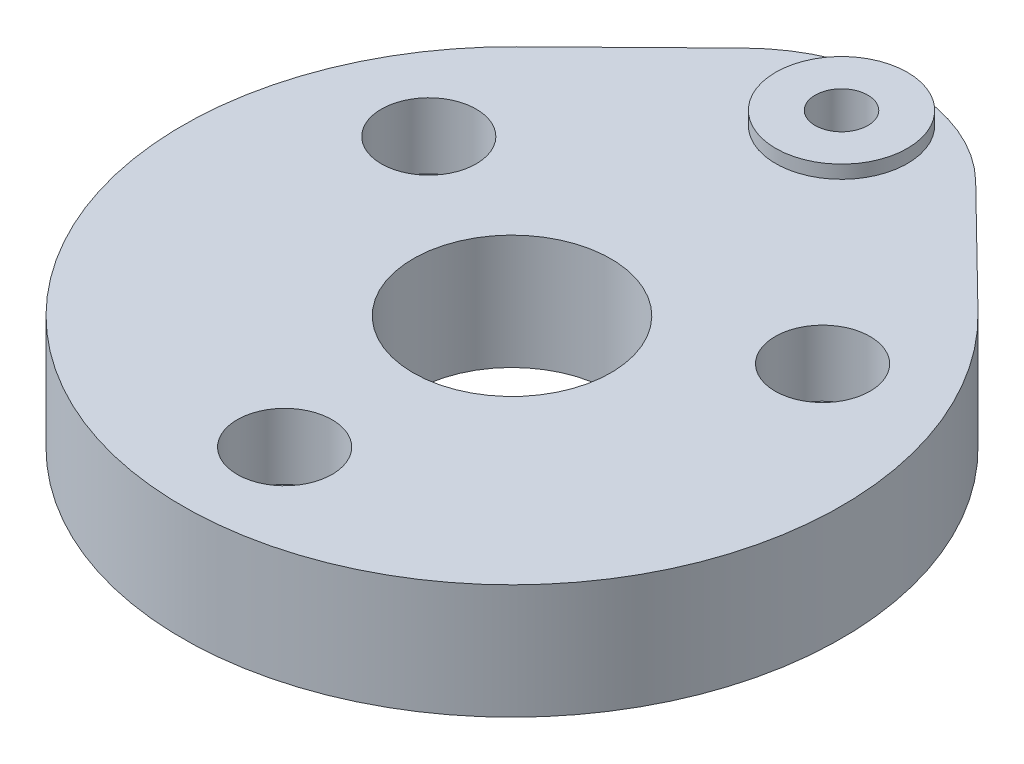
ISO-10303-21;
HEADER;
FILE_DESCRIPTION(('STEP AP214'),'2;1');
FILE_NAME('part.step','',(''),(''),'','','');
FILE_SCHEMA(('AUTOMOTIVE_DESIGN { 1 0 10303 214 1 1 1 1 }'));
ENDSEC;
DATA;
#1=APPLICATION_CONTEXT('core data for automotive mechanical design processes');
#2=APPLICATION_PROTOCOL_DEFINITION('international standard','automotive_design',2000,#1);
#3=PRODUCT_CONTEXT('',#1,'mechanical');
#4=PRODUCT('Part','Part','',(#3));
#5=PRODUCT_RELATED_PRODUCT_CATEGORY('part','',(#4));
#6=PRODUCT_DEFINITION_FORMATION('','',#4);
#7=PRODUCT_DEFINITION_CONTEXT('part definition',#1,'design');
#8=PRODUCT_DEFINITION('design','',#6,#7);
#9=PRODUCT_DEFINITION_SHAPE('','',#8);
#10=(LENGTH_UNIT() NAMED_UNIT(*) SI_UNIT(.MILLI.,.METRE.));
#11=(NAMED_UNIT(*) PLANE_ANGLE_UNIT() SI_UNIT($,.RADIAN.));
#12=(NAMED_UNIT(*) SI_UNIT($,.STERADIAN.) SOLID_ANGLE_UNIT());
#13=UNCERTAINTY_MEASURE_WITH_UNIT(LENGTH_MEASURE(1.E-05),#10,'distance_accuracy_value','');
#14=(GEOMETRIC_REPRESENTATION_CONTEXT(3) GLOBAL_UNCERTAINTY_ASSIGNED_CONTEXT((#13)) GLOBAL_UNIT_ASSIGNED_CONTEXT((#10,
#11,#12)) REPRESENTATION_CONTEXT('',''));
#15=CARTESIAN_POINT('',(0.,0.,0.));
#16=DIRECTION('',(0.,0.,1.));
#17=DIRECTION('',(1.,0.,0.));
#18=AXIS2_PLACEMENT_3D('',#15,#16,#17);
#19=CARTESIAN_POINT('',(0.,0.,-25.));
#20=DIRECTION('',(0.,1.,0.));
#21=DIRECTION('',(0.,0.,1.));
#22=AXIS2_PLACEMENT_3D('',#19,#20,#21);
#23=CYLINDRICAL_SURFACE('',#22,2.);
#24=CARTESIAN_POINT('',(0.,9.7,-25.));
#25=DIRECTION('',(0.,1.,0.));
#26=DIRECTION('',(0.,0.,1.));
#27=AXIS2_PLACEMENT_3D('',#24,#25,#26);
#28=CIRCLE('',#27,2.);
#29=CARTESIAN_POINT('',(0.,9.7,-23.));
#30=VERTEX_POINT('',#29);
#31=EDGE_CURVE('E340',#30,#30,#28,.T.);
#32=ORIENTED_EDGE('',*,*,#31,.T.);
#33=EDGE_LOOP('',(#32));
#34=FACE_BOUND('',#33,.T.);
#35=CARTESIAN_POINT('',(0.,2.7,-25.));
#36=DIRECTION('',(0.,-1.,0.));
#37=DIRECTION('',(0.,0.,-1.));
#38=AXIS2_PLACEMENT_3D('',#35,#36,#37);
#39=CIRCLE('',#38,2.);
#40=CARTESIAN_POINT('',(0.,2.7,-27.));
#41=VERTEX_POINT('',#40);
#42=EDGE_CURVE('E45',#41,#41,#39,.F.);
#43=ORIENTED_EDGE('',*,*,#42,.F.);
#44=EDGE_LOOP('',(#43));
#45=FACE_BOUND('',#44,.T.);
#46=ADVANCED_FACE('F41',(#34,#45),#23,.F.);
#47=CARTESIAN_POINT('',(14.9389382152816,8.7,-8.62500000000002));
#48=DIRECTION('',(0.,-1.,0.));
#49=DIRECTION('',(0.,0.,-1.));
#50=AXIS2_PLACEMENT_3D('',#47,#48,#49);
#51=CYLINDRICAL_SURFACE('',#50,1.9);
#52=CARTESIAN_POINT('',(14.9389382152816,0.,-8.62500000000002));
#53=DIRECTION('',(0.,1.,0.));
#54=DIRECTION('',(0.,0.,1.));
#55=AXIS2_PLACEMENT_3D('',#52,#53,#54);
#56=CIRCLE('',#55,1.9);
#57=CARTESIAN_POINT('',(14.9389382152816,0.,-6.72500000000003));
#58=VERTEX_POINT('',#57);
#59=EDGE_CURVE('E174',#58,#58,#56,.T.);
#60=ORIENTED_EDGE('',*,*,#59,.F.);
#61=EDGE_LOOP('',(#60));
#62=FACE_BOUND('',#61,.T.);
#63=CARTESIAN_POINT('',(14.9389382152816,3.7,-8.62500000000002));
#64=DIRECTION('',(0.,1.,0.));
#65=DIRECTION('',(0.,0.,1.));
#66=AXIS2_PLACEMENT_3D('',#63,#64,#65);
#67=CIRCLE('',#66,1.9);
#68=CARTESIAN_POINT('',(14.9389382152816,3.7,-6.72500000000003));
#69=VERTEX_POINT('',#68);
#70=EDGE_CURVE('E165',#69,#69,#67,.T.);
#71=ORIENTED_EDGE('',*,*,#70,.T.);
#72=EDGE_LOOP('',(#71));
#73=FACE_BOUND('',#72,.T.);
#74=ADVANCED_FACE('F193',(#62,#73),#51,.F.);
#75=CARTESIAN_POINT('',(0.,8.7,17.25));
#76=DIRECTION('',(0.,-1.,0.));
#77=DIRECTION('',(0.,0.,-1.));
#78=AXIS2_PLACEMENT_3D('',#75,#76,#77);
#79=CYLINDRICAL_SURFACE('',#78,1.9);
#80=CARTESIAN_POINT('',(0.,0.,17.25));
#81=DIRECTION('',(0.,1.,0.));
#82=DIRECTION('',(0.,0.,1.));
#83=AXIS2_PLACEMENT_3D('',#80,#81,#82);
#84=CIRCLE('',#83,1.9);
#85=CARTESIAN_POINT('',(0.,0.,19.15));
#86=VERTEX_POINT('',#85);
#87=EDGE_CURVE('E164',#86,#86,#84,.T.);
#88=ORIENTED_EDGE('',*,*,#87,.F.);
#89=EDGE_LOOP('',(#88));
#90=FACE_BOUND('',#89,.T.);
#91=CARTESIAN_POINT('',(0.,3.7,17.25));
#92=DIRECTION('',(0.,1.,0.));
#93=DIRECTION('',(0.,0.,1.));
#94=AXIS2_PLACEMENT_3D('',#91,#92,#93);
#95=CIRCLE('',#94,1.9);
#96=CARTESIAN_POINT('',(0.,3.7,19.15));
#97=VERTEX_POINT('',#96);
#98=EDGE_CURVE('E186',#97,#97,#95,.T.);
#99=ORIENTED_EDGE('',*,*,#98,.T.);
#100=EDGE_LOOP('',(#99));
#101=FACE_BOUND('',#100,.T.);
#102=ADVANCED_FACE('F219',(#90,#101),#79,.F.);
#103=CARTESIAN_POINT('',(-14.9389382152816,8.7,-8.62499999999998));
#104=DIRECTION('',(0.,-1.,0.));
#105=DIRECTION('',(0.,0.,-1.));
#106=AXIS2_PLACEMENT_3D('',#103,#104,#105);
#107=CYLINDRICAL_SURFACE('',#106,1.89999999999999);
#108=CARTESIAN_POINT('',(-14.9389382152816,0.,-8.62499999999998));
#109=DIRECTION('',(0.,1.,0.));
#110=DIRECTION('',(0.,0.,1.));
#111=AXIS2_PLACEMENT_3D('',#108,#109,#110);
#112=CIRCLE('',#111,1.89999999999999);
#113=CARTESIAN_POINT('',(-14.9389382152816,0.,-6.72499999999998));
#114=VERTEX_POINT('',#113);
#115=EDGE_CURVE('E160',#114,#114,#112,.T.);
#116=ORIENTED_EDGE('',*,*,#115,.F.);
#117=EDGE_LOOP('',(#116));
#118=FACE_BOUND('',#117,.T.);
#119=CARTESIAN_POINT('',(-14.9389382152816,3.7,-8.62499999999998));
#120=DIRECTION('',(0.,1.,0.));
#121=DIRECTION('',(0.,0.,1.));
#122=AXIS2_PLACEMENT_3D('',#119,#120,#121);
#123=CIRCLE('',#122,1.89999999999999);
#124=CARTESIAN_POINT('',(-14.9389382152816,3.7,-6.72499999999998));
#125=VERTEX_POINT('',#124);
#126=EDGE_CURVE('E139',#125,#125,#123,.T.);
#127=ORIENTED_EDGE('',*,*,#126,.T.);
#128=EDGE_LOOP('',(#127));
#129=FACE_BOUND('',#128,.T.);
#130=ADVANCED_FACE('F211',(#118,#129),#107,.F.);
#131=CARTESIAN_POINT('',(0.,8.7,0.));
#132=DIRECTION('',(0.,1.,0.));
#133=DIRECTION('',(0.,0.,1.));
#134=AXIS2_PLACEMENT_3D('',#131,#132,#133);
#135=PLANE('',#134);
#136=CARTESIAN_POINT('',(0.,8.7,17.25));
#137=DIRECTION('',(0.,1.,0.));
#138=DIRECTION('',(0.,0.,1.));
#139=AXIS2_PLACEMENT_3D('',#136,#137,#138);
#140=CIRCLE('',#139,3.6);
#141=CARTESIAN_POINT('',(0.,8.7,20.85));
#142=VERTEX_POINT('',#141);
#143=EDGE_CURVE('E140',#142,#142,#140,.T.);
#144=ORIENTED_EDGE('',*,*,#143,.F.);
#145=EDGE_LOOP('',(#144));
#146=FACE_BOUND('',#145,.T.);
#147=CARTESIAN_POINT('',(-14.9389382152816,8.7,-8.62499999999997));
#148=DIRECTION('',(0.,1.,0.));
#149=DIRECTION('',(0.,0.,1.));
#150=AXIS2_PLACEMENT_3D('',#147,#148,#149);
#151=CIRCLE('',#150,3.6);
#152=CARTESIAN_POINT('',(-14.9389382152816,8.7,-5.02499999999997));
#153=VERTEX_POINT('',#152);
#154=EDGE_CURVE('E148',#153,#153,#151,.T.);
#155=ORIENTED_EDGE('',*,*,#154,.F.);
#156=EDGE_LOOP('',(#155));
#157=FACE_BOUND('',#156,.T.);
#158=CARTESIAN_POINT('',(14.9389382152816,8.7,-8.62500000000002));
#159=DIRECTION('',(0.,1.,0.));
#160=DIRECTION('',(0.,0.,1.));
#161=AXIS2_PLACEMENT_3D('',#158,#159,#160);
#162=CIRCLE('',#161,3.6);
#163=CARTESIAN_POINT('',(14.9389382152816,8.7,-5.02500000000002));
#164=VERTEX_POINT('',#163);
#165=EDGE_CURVE('E156',#164,#164,#162,.T.);
#166=ORIENTED_EDGE('',*,*,#165,.F.);
#167=EDGE_LOOP('',(#166));
#168=FACE_BOUND('',#167,.T.);
#169=CARTESIAN_POINT('',(0.,8.7,-17.5));
#170=DIRECTION('',(0.,1.,0.));
#171=DIRECTION('',(0.,0.,1.));
#172=AXIS2_PLACEMENT_3D('',#169,#170,#171);
#173=CIRCLE('',#172,12.5);
#174=CARTESIAN_POINT('',(0.,8.7,-30.));
#175=VERTEX_POINT('',#174);
#176=CARTESIAN_POINT('',(8.74817765279707,8.7,-26.4285714285714));
#177=VERTEX_POINT('',#176);
#178=EDGE_CURVE('E87',#175,#177,#173,.F.);
#179=ORIENTED_EDGE('',*,*,#178,.F.);
#180=CARTESIAN_POINT('',(0.,8.7,-25.));
#181=DIRECTION('',(0.,1.,0.));
#182=DIRECTION('',(0.,0.,1.));
#183=AXIS2_PLACEMENT_3D('',#180,#181,#182);
#184=CIRCLE('',#183,5.);
#185=EDGE_CURVE('E103',#175,#175,#184,.T.);
#186=ORIENTED_EDGE('',*,*,#185,.F.);
#187=CARTESIAN_POINT('',(-8.74817765279707,8.7,-26.4285714285714));
#188=VERTEX_POINT('',#187);
#189=EDGE_CURVE('E83',#188,#175,#173,.F.);
#190=ORIENTED_EDGE('',*,*,#189,.F.);
#191=DIRECTION('',(0.714285714285714,0.,-0.699854212223765));
#192=VECTOR('',#191,1.);
#193=CARTESIAN_POINT('',(-17.4963553055941,8.7,-17.8571428571429));
#194=LINE('',#193,#192);
#195=CARTESIAN_POINT('',(-17.4963553055941,8.7,-17.8571428571429));
#196=VERTEX_POINT('',#195);
#197=EDGE_CURVE('E97',#196,#188,#194,.T.);
#198=ORIENTED_EDGE('',*,*,#197,.F.);
#199=CARTESIAN_POINT('',(0.,8.7,0.));
#200=DIRECTION('',(0.,1.,0.));
#201=DIRECTION('',(0.,0.,1.));
#202=AXIS2_PLACEMENT_3D('',#199,#200,#201);
#203=CIRCLE('',#202,25.);
#204=CARTESIAN_POINT('',(17.4963553055941,8.7,-17.8571428571429));
#205=VERTEX_POINT('',#204);
#206=EDGE_CURVE('E11',#196,#205,#203,.T.);
#207=ORIENTED_EDGE('',*,*,#206,.T.);
#208=DIRECTION('',(0.714285714285714,0.,0.699854212223765));
#209=VECTOR('',#208,1.);
#210=CARTESIAN_POINT('',(17.4963553055941,8.7,-17.8571428571429));
#211=LINE('',#210,#209);
#212=EDGE_CURVE('E105',#177,#205,#211,.T.);
#213=ORIENTED_EDGE('',*,*,#212,.F.);
#214=EDGE_LOOP('',(#179,#186,#190,#198,#207,#213));
#215=FACE_BOUND('',#214,.T.);
#216=CARTESIAN_POINT('',(0.,8.7,0.));
#217=DIRECTION('',(0.,1.,0.));
#218=DIRECTION('',(0.,0.,1.));
#219=AXIS2_PLACEMENT_3D('',#216,#217,#218);
#220=CIRCLE('',#219,7.5);
#221=CARTESIAN_POINT('',(0.,8.7,7.5));
#222=VERTEX_POINT('',#221);
#223=EDGE_CURVE('E170',#222,#222,#220,.T.);
#224=ORIENTED_EDGE('',*,*,#223,.F.);
#225=EDGE_LOOP('',(#224));
#226=FACE_BOUND('',#225,.T.);
#227=ADVANCED_FACE('F100',(#146,#157,#168,#215,#226),#135,.T.);
#228=CARTESIAN_POINT('',(0.,0.,0.));
#229=DIRECTION('',(0.,1.,0.));
#230=DIRECTION('',(0.,0.,1.));
#231=AXIS2_PLACEMENT_3D('',#228,#229,#230);
#232=PLANE('',#231);
#233=CARTESIAN_POINT('',(0.,0.,-25.));
#234=DIRECTION('',(0.,-1.,0.));
#235=DIRECTION('',(0.,0.,-1.));
#236=AXIS2_PLACEMENT_3D('',#233,#234,#235);
#237=CIRCLE('',#236,3.75);
#238=CARTESIAN_POINT('',(0.,0.,-28.75));
#239=VERTEX_POINT('',#238);
#240=EDGE_CURVE('E349',#239,#239,#237,.T.);
#241=ORIENTED_EDGE('',*,*,#240,.F.);
#242=EDGE_LOOP('',(#241));
#243=FACE_BOUND('',#242,.T.);
#244=CARTESIAN_POINT('',(0.,0.,0.));
#245=DIRECTION('',(0.,1.,0.));
#246=DIRECTION('',(0.,0.,1.));
#247=AXIS2_PLACEMENT_3D('',#244,#245,#246);
#248=CIRCLE('',#247,25.);
#249=CARTESIAN_POINT('',(-17.4963553055941,0.,-17.8571428571429));
#250=VERTEX_POINT('',#249);
#251=CARTESIAN_POINT('',(17.4963553055941,0.,-17.8571428571429));
#252=VERTEX_POINT('',#251);
#253=EDGE_CURVE('E51',#250,#252,#248,.T.);
#254=ORIENTED_EDGE('',*,*,#253,.F.);
#255=DIRECTION('',(-0.714285714285714,0.,0.699854212223765));
#256=VECTOR('',#255,1.);
#257=CARTESIAN_POINT('',(-17.4963553055941,0.,-17.8571428571429));
#258=LINE('',#257,#256);
#259=CARTESIAN_POINT('',(-8.74817765279707,0.,-26.4285714285714));
#260=VERTEX_POINT('',#259);
#261=EDGE_CURVE('E122',#260,#250,#258,.T.);
#262=ORIENTED_EDGE('',*,*,#261,.F.);
#263=CARTESIAN_POINT('',(0.,0.,-17.5));
#264=DIRECTION('',(0.,1.,0.));
#265=DIRECTION('',(0.,0.,1.));
#266=AXIS2_PLACEMENT_3D('',#263,#264,#265);
#267=CIRCLE('',#266,12.5);
#268=CARTESIAN_POINT('',(8.74817765279707,0.,-26.4285714285714));
#269=VERTEX_POINT('',#268);
#270=EDGE_CURVE('E113',#269,#260,#267,.T.);
#271=ORIENTED_EDGE('',*,*,#270,.F.);
#272=DIRECTION('',(-0.714285714285714,0.,-0.699854212223765));
#273=VECTOR('',#272,1.);
#274=CARTESIAN_POINT('',(17.4963553055941,0.,-17.8571428571429));
#275=LINE('',#274,#273);
#276=EDGE_CURVE('E134',#252,#269,#275,.T.);
#277=ORIENTED_EDGE('',*,*,#276,.F.);
#278=EDGE_LOOP('',(#254,#262,#271,#277));
#279=FACE_BOUND('',#278,.T.);
#280=ORIENTED_EDGE('',*,*,#59,.T.);
#281=EDGE_LOOP('',(#280));
#282=FACE_BOUND('',#281,.T.);
#283=CARTESIAN_POINT('',(0.,0.,0.));
#284=DIRECTION('',(0.,1.,0.));
#285=DIRECTION('',(0.,0.,1.));
#286=AXIS2_PLACEMENT_3D('',#283,#284,#285);
#287=CIRCLE('',#286,7.5);
#288=CARTESIAN_POINT('',(0.,0.,7.5));
#289=VERTEX_POINT('',#288);
#290=EDGE_CURVE('E169',#289,#289,#287,.T.);
#291=ORIENTED_EDGE('',*,*,#290,.T.);
#292=EDGE_LOOP('',(#291));
#293=FACE_BOUND('',#292,.T.);
#294=ORIENTED_EDGE('',*,*,#87,.T.);
#295=EDGE_LOOP('',(#294));
#296=FACE_BOUND('',#295,.T.);
#297=ORIENTED_EDGE('',*,*,#115,.T.);
#298=EDGE_LOOP('',(#297));
#299=FACE_BOUND('',#298,.T.);
#300=ADVANCED_FACE('F210',(#243,#279,#282,#293,#296,#299),#232,.F.);
#301=CARTESIAN_POINT('',(0.,8.7,0.));
#302=DIRECTION('',(0.,-1.,0.));
#303=DIRECTION('',(0.,0.,-1.));
#304=AXIS2_PLACEMENT_3D('',#301,#302,#303);
#305=CYLINDRICAL_SURFACE('',#304,25.);
#306=ORIENTED_EDGE('',*,*,#206,.F.);
#307=DIRECTION('',(0.,1.,0.));
#308=VECTOR('',#307,1.);
#309=CARTESIAN_POINT('',(-17.4963553055941,-37.0396918927548,-17.8571428571429));
#310=LINE('',#309,#308);
#311=EDGE_CURVE('E126',#250,#196,#310,.T.);
#312=ORIENTED_EDGE('',*,*,#311,.F.);
#313=ORIENTED_EDGE('',*,*,#253,.T.);
#314=DIRECTION('',(0.,1.,0.));
#315=VECTOR('',#314,1.);
#316=CARTESIAN_POINT('',(17.4963553055941,-37.0396918927548,-17.8571428571429));
#317=LINE('',#316,#315);
#318=EDGE_CURVE('E123',#252,#205,#317,.T.);
#319=ORIENTED_EDGE('',*,*,#318,.T.);
#320=EDGE_LOOP('',(#306,#312,#313,#319));
#321=FACE_BOUND('',#320,.T.);
#322=ADVANCED_FACE('F43',(#321),#305,.T.);
#323=CARTESIAN_POINT('',(0.,8.7,0.));
#324=DIRECTION('',(0.,-1.,0.));
#325=DIRECTION('',(0.,0.,-1.));
#326=AXIS2_PLACEMENT_3D('',#323,#324,#325);
#327=CYLINDRICAL_SURFACE('',#326,7.5);
#328=ORIENTED_EDGE('',*,*,#223,.T.);
#329=EDGE_LOOP('',(#328));
#330=FACE_BOUND('',#329,.T.);
#331=ORIENTED_EDGE('',*,*,#290,.F.);
#332=EDGE_LOOP('',(#331));
#333=FACE_BOUND('',#332,.T.);
#334=ADVANCED_FACE('F261',(#330,#333),#327,.F.);
#335=CARTESIAN_POINT('',(-14.9389382152816,3.7,-8.62499999999997));
#336=DIRECTION('',(0.,1.,0.));
#337=DIRECTION('',(0.,0.,1.));
#338=AXIS2_PLACEMENT_3D('',#335,#336,#337);
#339=CYLINDRICAL_SURFACE('',#338,3.6);
#340=CARTESIAN_POINT('',(-14.9389382152816,3.7,-8.62499999999997));
#341=DIRECTION('',(0.,1.,0.));
#342=DIRECTION('',(0.,0.,1.));
#343=AXIS2_PLACEMENT_3D('',#340,#341,#342);
#344=CIRCLE('',#343,3.6);
#345=CARTESIAN_POINT('',(-14.9389382152816,3.7,-5.02499999999997));
#346=VERTEX_POINT('',#345);
#347=EDGE_CURVE('E144',#346,#346,#344,.T.);
#348=ORIENTED_EDGE('',*,*,#347,.F.);
#349=EDGE_LOOP('',(#348));
#350=FACE_BOUND('',#349,.T.);
#351=ORIENTED_EDGE('',*,*,#154,.T.);
#352=EDGE_LOOP('',(#351));
#353=FACE_BOUND('',#352,.T.);
#354=ADVANCED_FACE('F258',(#350,#353),#339,.F.);
#355=CARTESIAN_POINT('',(-14.9389382152816,3.7,-8.62499999999997));
#356=DIRECTION('',(0.,1.,0.));
#357=DIRECTION('',(0.,0.,1.));
#358=AXIS2_PLACEMENT_3D('',#355,#356,#357);
#359=PLANE('',#358);
#360=ORIENTED_EDGE('',*,*,#126,.F.);
#361=EDGE_LOOP('',(#360));
#362=FACE_BOUND('',#361,.T.);
#363=ORIENTED_EDGE('',*,*,#347,.T.);
#364=EDGE_LOOP('',(#363));
#365=FACE_BOUND('',#364,.T.);
#366=ADVANCED_FACE('F254',(#362,#365),#359,.T.);
#367=CARTESIAN_POINT('',(0.,3.7,17.25));
#368=DIRECTION('',(0.,1.,0.));
#369=DIRECTION('',(0.,0.,1.));
#370=AXIS2_PLACEMENT_3D('',#367,#368,#369);
#371=CYLINDRICAL_SURFACE('',#370,3.6);
#372=CARTESIAN_POINT('',(0.,3.7,17.25));
#373=DIRECTION('',(0.,1.,0.));
#374=DIRECTION('',(0.,0.,1.));
#375=AXIS2_PLACEMENT_3D('',#372,#373,#374);
#376=CIRCLE('',#375,3.6);
#377=CARTESIAN_POINT('',(0.,3.7,20.85));
#378=VERTEX_POINT('',#377);
#379=EDGE_CURVE('E135',#378,#378,#376,.T.);
#380=ORIENTED_EDGE('',*,*,#379,.F.);
#381=EDGE_LOOP('',(#380));
#382=FACE_BOUND('',#381,.T.);
#383=ORIENTED_EDGE('',*,*,#143,.T.);
#384=EDGE_LOOP('',(#383));
#385=FACE_BOUND('',#384,.T.);
#386=ADVANCED_FACE('F250',(#382,#385),#371,.F.);
#387=CARTESIAN_POINT('',(0.,3.7,17.25));
#388=DIRECTION('',(0.,1.,0.));
#389=DIRECTION('',(0.,0.,1.));
#390=AXIS2_PLACEMENT_3D('',#387,#388,#389);
#391=PLANE('',#390);
#392=ORIENTED_EDGE('',*,*,#98,.F.);
#393=EDGE_LOOP('',(#392));
#394=FACE_BOUND('',#393,.T.);
#395=ORIENTED_EDGE('',*,*,#379,.T.);
#396=EDGE_LOOP('',(#395));
#397=FACE_BOUND('',#396,.T.);
#398=ADVANCED_FACE('F205',(#394,#397),#391,.T.);
#399=CARTESIAN_POINT('',(14.9389382152816,3.7,-8.62500000000002));
#400=DIRECTION('',(0.,1.,0.));
#401=DIRECTION('',(0.,0.,1.));
#402=AXIS2_PLACEMENT_3D('',#399,#400,#401);
#403=CYLINDRICAL_SURFACE('',#402,3.6);
#404=CARTESIAN_POINT('',(14.9389382152816,3.7,-8.62500000000002));
#405=DIRECTION('',(0.,1.,0.));
#406=DIRECTION('',(0.,0.,1.));
#407=AXIS2_PLACEMENT_3D('',#404,#405,#406);
#408=CIRCLE('',#407,3.6);
#409=CARTESIAN_POINT('',(14.9389382152816,3.7,-5.02500000000002));
#410=VERTEX_POINT('',#409);
#411=EDGE_CURVE('E152',#410,#410,#408,.T.);
#412=ORIENTED_EDGE('',*,*,#411,.F.);
#413=EDGE_LOOP('',(#412));
#414=FACE_BOUND('',#413,.T.);
#415=ORIENTED_EDGE('',*,*,#165,.T.);
#416=EDGE_LOOP('',(#415));
#417=FACE_BOUND('',#416,.T.);
#418=ADVANCED_FACE('F199',(#414,#417),#403,.F.);
#419=CARTESIAN_POINT('',(14.9389382152816,3.7,-8.62500000000002));
#420=DIRECTION('',(0.,1.,0.));
#421=DIRECTION('',(0.,0.,1.));
#422=AXIS2_PLACEMENT_3D('',#419,#420,#421);
#423=PLANE('',#422);
#424=ORIENTED_EDGE('',*,*,#70,.F.);
#425=EDGE_LOOP('',(#424));
#426=FACE_BOUND('',#425,.T.);
#427=ORIENTED_EDGE('',*,*,#411,.T.);
#428=EDGE_LOOP('',(#427));
#429=FACE_BOUND('',#428,.T.);
#430=ADVANCED_FACE('F195',(#426,#429),#423,.T.);
#431=CARTESIAN_POINT('',(-17.4963553055941,-37.0396918927548,-17.8571428571429));
#432=DIRECTION('',(0.699854212223765,0.,0.714285714285714));
#433=DIRECTION('',(0.714285714285714,0.,-0.699854212223765));
#434=AXIS2_PLACEMENT_3D('',#431,#432,#433);
#435=PLANE('',#434);
#436=DIRECTION('',(0.,1.,0.));
#437=VECTOR('',#436,1.);
#438=CARTESIAN_POINT('',(-8.74817765279707,-37.0396918927548,-26.4285714285714));
#439=LINE('',#438,#437);
#440=EDGE_CURVE('E91',#260,#188,#439,.T.);
#441=ORIENTED_EDGE('',*,*,#440,.F.);
#442=ORIENTED_EDGE('',*,*,#261,.T.);
#443=ORIENTED_EDGE('',*,*,#311,.T.);
#444=ORIENTED_EDGE('',*,*,#197,.T.);
#445=EDGE_LOOP('',(#441,#442,#443,#444));
#446=FACE_BOUND('',#445,.T.);
#447=ADVANCED_FACE('F198',(#446),#435,.F.);
#448=CARTESIAN_POINT('',(17.4963553055941,-37.0396918927548,-17.8571428571429));
#449=DIRECTION('',(-0.699854212223765,0.,0.714285714285714));
#450=DIRECTION('',(0.714285714285714,0.,0.699854212223765));
#451=AXIS2_PLACEMENT_3D('',#448,#449,#450);
#452=PLANE('',#451);
#453=ORIENTED_EDGE('',*,*,#318,.F.);
#454=ORIENTED_EDGE('',*,*,#276,.T.);
#455=DIRECTION('',(0.,1.,0.));
#456=VECTOR('',#455,1.);
#457=CARTESIAN_POINT('',(8.74817765279707,-37.0396918927548,-26.4285714285714));
#458=LINE('',#457,#456);
#459=EDGE_CURVE('E119',#269,#177,#458,.T.);
#460=ORIENTED_EDGE('',*,*,#459,.T.);
#461=ORIENTED_EDGE('',*,*,#212,.T.);
#462=EDGE_LOOP('',(#453,#454,#460,#461));
#463=FACE_BOUND('',#462,.T.);
#464=ADVANCED_FACE('F238',(#463),#452,.F.);
#465=CARTESIAN_POINT('',(0.,-37.0396918927548,-17.5));
#466=DIRECTION('',(0.,1.,0.));
#467=DIRECTION('',(0.,0.,1.));
#468=AXIS2_PLACEMENT_3D('',#465,#466,#467);
#469=CYLINDRICAL_SURFACE('',#468,12.5);
#470=ORIENTED_EDGE('',*,*,#459,.F.);
#471=ORIENTED_EDGE('',*,*,#270,.T.);
#472=ORIENTED_EDGE('',*,*,#440,.T.);
#473=ORIENTED_EDGE('',*,*,#189,.T.);
#474=ORIENTED_EDGE('',*,*,#178,.T.);
#475=EDGE_LOOP('',(#470,#471,#472,#473,#474));
#476=FACE_BOUND('',#475,.T.);
#477=ADVANCED_FACE('F86',(#476),#469,.T.);
#478=CARTESIAN_POINT('',(0.,9.7,-25.));
#479=DIRECTION('',(0.,1.,0.));
#480=DIRECTION('',(0.,0.,1.));
#481=AXIS2_PLACEMENT_3D('',#478,#479,#480);
#482=PLANE('',#481);
#483=CARTESIAN_POINT('',(0.,9.7,-25.));
#484=DIRECTION('',(0.,1.,0.));
#485=DIRECTION('',(0.,0.,1.));
#486=AXIS2_PLACEMENT_3D('',#483,#484,#485);
#487=CIRCLE('',#486,5.);
#488=CARTESIAN_POINT('',(0.,9.7,-20.));
#489=VERTEX_POINT('',#488);
#490=EDGE_CURVE('E107',#489,#489,#487,.T.);
#491=ORIENTED_EDGE('',*,*,#490,.T.);
#492=EDGE_LOOP('',(#491));
#493=FACE_BOUND('',#492,.T.);
#494=ORIENTED_EDGE('',*,*,#31,.F.);
#495=EDGE_LOOP('',(#494));
#496=FACE_BOUND('',#495,.T.);
#497=ADVANCED_FACE('F247',(#493,#496),#482,.T.);
#498=CARTESIAN_POINT('',(0.,9.7,-25.));
#499=DIRECTION('',(0.,-1.,0.));
#500=DIRECTION('',(0.,0.,-1.));
#501=AXIS2_PLACEMENT_3D('',#498,#499,#500);
#502=CYLINDRICAL_SURFACE('',#501,5.);
#503=ORIENTED_EDGE('',*,*,#490,.F.);
#504=EDGE_LOOP('',(#503));
#505=FACE_BOUND('',#504,.T.);
#506=ORIENTED_EDGE('',*,*,#185,.T.);
#507=EDGE_LOOP('',(#506));
#508=FACE_BOUND('',#507,.T.);
#509=ADVANCED_FACE('F236',(#505,#508),#502,.T.);
#510=CARTESIAN_POINT('',(0.,2.7,-25.));
#511=DIRECTION('',(0.,-1.,0.));
#512=DIRECTION('',(0.,0.,-1.));
#513=AXIS2_PLACEMENT_3D('',#510,#511,#512);
#514=PLANE('',#513);
#515=CARTESIAN_POINT('',(0.,2.7,-25.));
#516=DIRECTION('',(0.,-1.,0.));
#517=DIRECTION('',(0.,0.,-1.));
#518=AXIS2_PLACEMENT_3D('',#515,#516,#517);
#519=CIRCLE('',#518,3.75);
#520=CARTESIAN_POINT('',(0.,2.7,-28.75));
#521=VERTEX_POINT('',#520);
#522=EDGE_CURVE('E347',#521,#521,#519,.T.);
#523=ORIENTED_EDGE('',*,*,#522,.T.);
#524=EDGE_LOOP('',(#523));
#525=FACE_BOUND('',#524,.T.);
#526=ORIENTED_EDGE('',*,*,#42,.T.);
#527=EDGE_LOOP('',(#526));
#528=FACE_BOUND('',#527,.T.);
#529=ADVANCED_FACE('F310',(#525,#528),#514,.T.);
#530=CARTESIAN_POINT('',(0.,2.7,-25.));
#531=DIRECTION('',(0.,-1.,0.));
#532=DIRECTION('',(0.,0.,-1.));
#533=AXIS2_PLACEMENT_3D('',#530,#531,#532);
#534=CYLINDRICAL_SURFACE('',#533,3.75);
#535=CARTESIAN_POINT('',(0.,2.7,-28.75));
#536=CARTESIAN_POINT('',(0.,2.671875,-28.75));
#537=CARTESIAN_POINT('',(0.,2.64375,-28.75));
#538=CARTESIAN_POINT('',(0.,2.5875,-28.75));
#539=CARTESIAN_POINT('',(0.,2.559375,-28.75));
#540=CARTESIAN_POINT('',(0.,2.503125,-28.75));
#541=CARTESIAN_POINT('',(0.,2.475,-28.75));
#542=CARTESIAN_POINT('',(0.,2.41875,-28.75));
#543=CARTESIAN_POINT('',(0.,2.390625,-28.75));
#544=CARTESIAN_POINT('',(0.,2.334375,-28.75));
#545=CARTESIAN_POINT('',(0.,2.30625,-28.75));
#546=CARTESIAN_POINT('',(0.,2.25,-28.75));
#547=CARTESIAN_POINT('',(0.,2.221875,-28.75));
#548=CARTESIAN_POINT('',(0.,2.165625,-28.75));
#549=CARTESIAN_POINT('',(0.,2.1375,-28.75));
#550=CARTESIAN_POINT('',(0.,2.08125,-28.75));
#551=CARTESIAN_POINT('',(0.,2.053125,-28.75));
#552=CARTESIAN_POINT('',(0.,1.996875,-28.75));
#553=CARTESIAN_POINT('',(0.,1.96875,-28.75));
#554=CARTESIAN_POINT('',(0.,1.9125,-28.75));
#555=CARTESIAN_POINT('',(0.,1.884375,-28.75));
#556=CARTESIAN_POINT('',(0.,1.828125,-28.75));
#557=CARTESIAN_POINT('',(0.,1.8,-28.75));
#558=CARTESIAN_POINT('',(0.,1.74375,-28.75));
#559=CARTESIAN_POINT('',(0.,1.715625,-28.75));
#560=CARTESIAN_POINT('',(0.,1.659375,-28.75));
#561=CARTESIAN_POINT('',(0.,1.63125,-28.75));
#562=CARTESIAN_POINT('',(0.,1.575,-28.75));
#563=CARTESIAN_POINT('',(0.,1.546875,-28.75));
#564=CARTESIAN_POINT('',(0.,1.490625,-28.75));
#565=CARTESIAN_POINT('',(0.,1.4625,-28.75));
#566=CARTESIAN_POINT('',(0.,1.40625,-28.75));
#567=CARTESIAN_POINT('',(0.,1.378125,-28.75));
#568=CARTESIAN_POINT('',(0.,1.321875,-28.75));
#569=CARTESIAN_POINT('',(0.,1.29375,-28.75));
#570=CARTESIAN_POINT('',(0.,1.2375,-28.75));
#571=CARTESIAN_POINT('',(0.,1.209375,-28.75));
#572=CARTESIAN_POINT('',(0.,1.153125,-28.75));
#573=CARTESIAN_POINT('',(0.,1.125,-28.75));
#574=CARTESIAN_POINT('',(0.,1.06875,-28.75));
#575=CARTESIAN_POINT('',(0.,1.040625,-28.75));
#576=CARTESIAN_POINT('',(0.,0.984375,-28.75));
#577=CARTESIAN_POINT('',(0.,0.95625,-28.75));
#578=CARTESIAN_POINT('',(0.,0.9,-28.75));
#579=CARTESIAN_POINT('',(0.,0.871875000000001,-28.75));
#580=CARTESIAN_POINT('',(0.,0.815625,-28.75));
#581=CARTESIAN_POINT('',(0.,0.787500000000001,-28.75));
#582=CARTESIAN_POINT('',(0.,0.731250000000001,-28.75));
#583=CARTESIAN_POINT('',(0.,0.703125000000001,-28.75));
#584=CARTESIAN_POINT('',(0.,0.646875000000001,-28.75));
#585=CARTESIAN_POINT('',(0.,0.61875,-28.75));
#586=CARTESIAN_POINT('',(0.,0.5625,-28.75));
#587=CARTESIAN_POINT('',(0.,0.534375000000001,-28.75));
#588=CARTESIAN_POINT('',(0.,0.478125000000001,-28.75));
#589=CARTESIAN_POINT('',(0.,0.45,-28.75));
#590=CARTESIAN_POINT('',(0.,0.39375,-28.75));
#591=CARTESIAN_POINT('',(0.,0.365625,-28.75));
#592=CARTESIAN_POINT('',(0.,0.309375,-28.75));
#593=CARTESIAN_POINT('',(0.,0.28125,-28.75));
#594=CARTESIAN_POINT('',(0.,0.225,-28.75));
#595=CARTESIAN_POINT('',(0.,0.196875,-28.75));
#596=CARTESIAN_POINT('',(0.,0.140625,-28.75));
#597=CARTESIAN_POINT('',(0.,0.1125,-28.75));
#598=CARTESIAN_POINT('',(0.,0.0562500000000003,-28.75));
#599=CARTESIAN_POINT('',(0.,0.0281250000000003,-28.75));
#600=CARTESIAN_POINT('',(0.,0.,-28.75));
#601=B_SPLINE_CURVE_WITH_KNOTS('',3,(#535,#536,#537,#538,#539,#540,#541,#542,#543,#544,#545,
#546,#547,#548,#549,#550,#551,#552,#553,#554,#555,#556,#557,#558,#559,#560,#561,#562,#563,#564,
#565,#566,#567,#568,#569,#570,#571,#572,#573,#574,#575,#576,#577,#578,#579,#580,#581,#582,#583,
#584,#585,#586,#587,#588,#589,#590,#591,#592,#593,#594,#595,#596,#597,#598,#599,#600),
.UNSPECIFIED.,.F.,.F.,(4,2,2,2,2,2,2,2,2,2,2,2,2,2,2,2,2,2,2,2,2,2,2,2,2,2,2,2,2,2,2,2,4),(0.,
0.0843749999999998,0.16875,0.253125,0.3375,0.421875,0.50625,0.590625,0.675,0.759375,0.84375,
0.928125,1.0125,1.096875,1.18125,1.265625,1.35,1.434375,1.51875,1.603125,1.6875,1.771875,
1.85625,1.940625,2.025,2.109375,2.19375,2.278125,2.3625,2.446875,2.53125,2.615625,2.7),.UNSPECIFIED.);
#602=EDGE_CURVE('BSEAM315',#521,#239,#601,.T.);
#603=ORIENTED_EDGE('',*,*,#522,.F.);
#604=ORIENTED_EDGE('',*,*,#240,.T.);
#605=ORIENTED_EDGE('',*,*,#602,.T.);
#606=ORIENTED_EDGE('',*,*,#602,.F.);
#607=EDGE_LOOP('',(#603,#605,#604,#606));
#608=FACE_BOUND('',#607,.T.);
#609=ADVANCED_FACE('F315',(#608),#534,.F.);
#610=CLOSED_SHELL('',(#46,#74,#102,#130,#227,#300,#322,#334,#354,#366,#386,#398,#418,#430,#447,
#464,#477,#497,#509,#529,#609));
#611=MANIFOLD_SOLID_BREP('B2',#610);
#612=ADVANCED_BREP_SHAPE_REPRESENTATION('',(#18,#611),#14);
#613=SHAPE_DEFINITION_REPRESENTATION(#9,#612);
ENDSEC;
END-ISO-10303-21;
